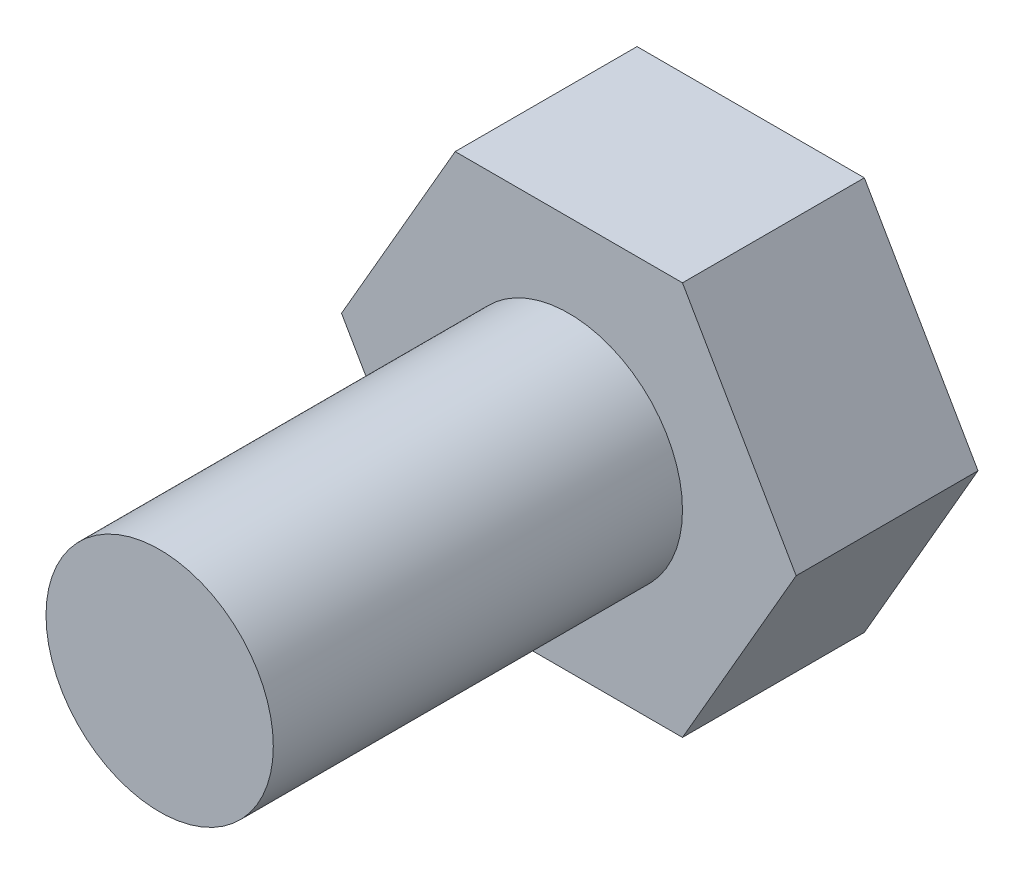
ISO-10303-21;
HEADER;
FILE_DESCRIPTION(('STEP AP214'),'2;1');
FILE_NAME('part.step','',(''),(''),'','','');
FILE_SCHEMA(('AUTOMOTIVE_DESIGN { 1 0 10303 214 1 1 1 1 }'));
ENDSEC;
DATA;
#1=APPLICATION_CONTEXT('core data for automotive mechanical design processes');
#2=APPLICATION_PROTOCOL_DEFINITION('international standard','automotive_design',2000,#1);
#3=PRODUCT_CONTEXT('',#1,'mechanical');
#4=PRODUCT('Part','Part','',(#3));
#5=PRODUCT_RELATED_PRODUCT_CATEGORY('part','',(#4));
#6=PRODUCT_DEFINITION_FORMATION('','',#4);
#7=PRODUCT_DEFINITION_CONTEXT('part definition',#1,'design');
#8=PRODUCT_DEFINITION('design','',#6,#7);
#9=PRODUCT_DEFINITION_SHAPE('','',#8);
#10=(LENGTH_UNIT() NAMED_UNIT(*) SI_UNIT(.MILLI.,.METRE.));
#11=(NAMED_UNIT(*) PLANE_ANGLE_UNIT() SI_UNIT($,.RADIAN.));
#12=(NAMED_UNIT(*) SI_UNIT($,.STERADIAN.) SOLID_ANGLE_UNIT());
#13=UNCERTAINTY_MEASURE_WITH_UNIT(LENGTH_MEASURE(1.E-05),#10,'distance_accuracy_value','');
#14=(GEOMETRIC_REPRESENTATION_CONTEXT(3) GLOBAL_UNCERTAINTY_ASSIGNED_CONTEXT((#13)) GLOBAL_UNIT_ASSIGNED_CONTEXT((#10,
#11,#12)) REPRESENTATION_CONTEXT('',''));
#15=CARTESIAN_POINT('',(0.,0.,0.));
#16=DIRECTION('',(0.,0.,1.));
#17=DIRECTION('',(1.,0.,0.));
#18=AXIS2_PLACEMENT_3D('',#15,#16,#17);
#19=CARTESIAN_POINT('',(2.50000000000005,-4.33012701892216,2.));
#20=DIRECTION('',(-0.866025403784442,0.499999999999995,0.));
#21=DIRECTION('',(-0.499999999999995,-0.866025403784442,0.));
#22=AXIS2_PLACEMENT_3D('',#19,#20,#21);
#23=PLANE('',#22);
#24=DIRECTION('',(0.499999999999995,0.866025403784442,0.));
#25=VECTOR('',#24,1.);
#26=CARTESIAN_POINT('',(2.50000000000005,-4.33012701892216,-2.));
#27=LINE('',#26,#25);
#28=CARTESIAN_POINT('',(2.50000000000005,-4.33012701892216,-2.));
#29=VERTEX_POINT('',#28);
#30=CARTESIAN_POINT('',(5.,0.,-2.));
#31=VERTEX_POINT('',#30);
#32=EDGE_CURVE('E119',#29,#31,#27,.T.);
#33=ORIENTED_EDGE('',*,*,#32,.T.);
#34=DIRECTION('',(0.,0.,-1.));
#35=VECTOR('',#34,1.);
#36=CARTESIAN_POINT('',(5.,0.,2.));
#37=LINE('',#36,#35);
#38=CARTESIAN_POINT('',(5.,0.,2.));
#39=VERTEX_POINT('',#38);
#40=EDGE_CURVE('E36',#39,#31,#37,.T.);
#41=ORIENTED_EDGE('',*,*,#40,.F.);
#42=DIRECTION('',(0.499999999999995,0.866025403784442,0.));
#43=VECTOR('',#42,1.);
#44=CARTESIAN_POINT('',(2.50000000000005,-4.33012701892216,2.));
#45=LINE('',#44,#43);
#46=CARTESIAN_POINT('',(2.50000000000005,-4.33012701892216,2.));
#47=VERTEX_POINT('',#46);
#48=EDGE_CURVE('E130',#47,#39,#45,.T.);
#49=ORIENTED_EDGE('',*,*,#48,.F.);
#50=DIRECTION('',(0.,0.,-1.));
#51=VECTOR('',#50,1.);
#52=CARTESIAN_POINT('',(2.50000000000005,-4.33012701892216,2.));
#53=LINE('',#52,#51);
#54=EDGE_CURVE('E115',#47,#29,#53,.T.);
#55=ORIENTED_EDGE('',*,*,#54,.T.);
#56=EDGE_LOOP('',(#33,#41,#49,#55));
#57=FACE_BOUND('',#56,.T.);
#58=ADVANCED_FACE('F33',(#57),#23,.F.);
#59=CARTESIAN_POINT('',(5.,0.,2.));
#60=DIRECTION('',(-0.866025403784438,-0.500000000000001,0.));
#61=DIRECTION('',(0.500000000000001,-0.866025403784438,0.));
#62=AXIS2_PLACEMENT_3D('',#59,#60,#61);
#63=PLANE('',#62);
#64=DIRECTION('',(-0.500000000000001,0.866025403784438,0.));
#65=VECTOR('',#64,1.);
#66=CARTESIAN_POINT('',(5.,0.,-2.));
#67=LINE('',#66,#65);
#68=CARTESIAN_POINT('',(2.49999999999999,4.3301270189222,-2.));
#69=VERTEX_POINT('',#68);
#70=EDGE_CURVE('E122',#31,#69,#67,.T.);
#71=ORIENTED_EDGE('',*,*,#70,.T.);
#72=DIRECTION('',(0.,0.,-1.));
#73=VECTOR('',#72,1.);
#74=CARTESIAN_POINT('',(2.49999999999999,4.3301270189222,2.));
#75=LINE('',#74,#73);
#76=CARTESIAN_POINT('',(2.49999999999999,4.3301270189222,2.));
#77=VERTEX_POINT('',#76);
#78=EDGE_CURVE('E133',#77,#69,#75,.T.);
#79=ORIENTED_EDGE('',*,*,#78,.F.);
#80=DIRECTION('',(-0.500000000000001,0.866025403784438,0.));
#81=VECTOR('',#80,1.);
#82=CARTESIAN_POINT('',(5.,0.,2.));
#83=LINE('',#82,#81);
#84=EDGE_CURVE('E88',#39,#77,#83,.T.);
#85=ORIENTED_EDGE('',*,*,#84,.F.);
#86=ORIENTED_EDGE('',*,*,#40,.T.);
#87=EDGE_LOOP('',(#71,#79,#85,#86));
#88=FACE_BOUND('',#87,.T.);
#89=ADVANCED_FACE('F138',(#88),#63,.F.);
#90=CARTESIAN_POINT('',(2.49999999999999,4.3301270189222,2.));
#91=DIRECTION('',(0.,-1.,0.));
#92=DIRECTION('',(1.,0.,0.));
#93=AXIS2_PLACEMENT_3D('',#90,#91,#92);
#94=PLANE('',#93);
#95=DIRECTION('',(-1.,0.,0.));
#96=VECTOR('',#95,1.);
#97=CARTESIAN_POINT('',(2.49999999999999,4.3301270189222,-2.));
#98=LINE('',#97,#96);
#99=CARTESIAN_POINT('',(-2.50000000000002,4.33012701892218,-2.));
#100=VERTEX_POINT('',#99);
#101=EDGE_CURVE('E125',#69,#100,#98,.T.);
#102=ORIENTED_EDGE('',*,*,#101,.T.);
#103=DIRECTION('',(0.,0.,-1.));
#104=VECTOR('',#103,1.);
#105=CARTESIAN_POINT('',(-2.50000000000002,4.33012701892218,2.));
#106=LINE('',#105,#104);
#107=CARTESIAN_POINT('',(-2.50000000000002,4.33012701892218,2.));
#108=VERTEX_POINT('',#107);
#109=EDGE_CURVE('E110',#108,#100,#106,.T.);
#110=ORIENTED_EDGE('',*,*,#109,.F.);
#111=DIRECTION('',(-1.,0.,0.));
#112=VECTOR('',#111,1.);
#113=CARTESIAN_POINT('',(2.49999999999999,4.3301270189222,2.));
#114=LINE('',#113,#112);
#115=EDGE_CURVE('E101',#77,#108,#114,.T.);
#116=ORIENTED_EDGE('',*,*,#115,.F.);
#117=ORIENTED_EDGE('',*,*,#78,.T.);
#118=EDGE_LOOP('',(#102,#110,#116,#117));
#119=FACE_BOUND('',#118,.T.);
#120=ADVANCED_FACE('F144',(#119),#94,.F.);
#121=CARTESIAN_POINT('',(-2.50000000000002,4.33012701892218,2.));
#122=DIRECTION('',(0.866025403784441,-0.499999999999995,0.));
#123=DIRECTION('',(0.499999999999995,0.866025403784442,0.));
#124=AXIS2_PLACEMENT_3D('',#121,#122,#123);
#125=PLANE('',#124);
#126=DIRECTION('',(-0.499999999999995,-0.866025403784441,0.));
#127=VECTOR('',#126,1.);
#128=CARTESIAN_POINT('',(-2.50000000000002,4.33012701892218,-2.));
#129=LINE('',#128,#127);
#130=CARTESIAN_POINT('',(-5.,0.,-2.));
#131=VERTEX_POINT('',#130);
#132=EDGE_CURVE('E109',#100,#131,#129,.T.);
#133=ORIENTED_EDGE('',*,*,#132,.T.);
#134=DIRECTION('',(0.,0.,-1.));
#135=VECTOR('',#134,1.);
#136=CARTESIAN_POINT('',(-5.,0.,2.));
#137=LINE('',#136,#135);
#138=CARTESIAN_POINT('',(-5.,0.,2.));
#139=VERTEX_POINT('',#138);
#140=EDGE_CURVE('E106',#139,#131,#137,.T.);
#141=ORIENTED_EDGE('',*,*,#140,.F.);
#142=DIRECTION('',(-0.499999999999995,-0.866025403784441,0.));
#143=VECTOR('',#142,1.);
#144=CARTESIAN_POINT('',(-2.50000000000002,4.33012701892218,2.));
#145=LINE('',#144,#143);
#146=EDGE_CURVE('E95',#108,#139,#145,.T.);
#147=ORIENTED_EDGE('',*,*,#146,.F.);
#148=ORIENTED_EDGE('',*,*,#109,.T.);
#149=EDGE_LOOP('',(#133,#141,#147,#148));
#150=FACE_BOUND('',#149,.T.);
#151=ADVANCED_FACE('F107',(#150),#125,.F.);
#152=CARTESIAN_POINT('',(-5.,0.,2.));
#153=DIRECTION('',(0.866025403784435,0.500000000000007,0.));
#154=DIRECTION('',(-0.500000000000007,0.866025403784435,0.));
#155=AXIS2_PLACEMENT_3D('',#152,#153,#154);
#156=PLANE('',#155);
#157=DIRECTION('',(0.500000000000007,-0.866025403784435,0.));
#158=VECTOR('',#157,1.);
#159=CARTESIAN_POINT('',(-5.,0.,-2.));
#160=LINE('',#159,#158);
#161=CARTESIAN_POINT('',(-2.49999999999996,-4.33012701892222,-2.));
#162=VERTEX_POINT('',#161);
#163=EDGE_CURVE('E73',#131,#162,#160,.T.);
#164=ORIENTED_EDGE('',*,*,#163,.T.);
#165=DIRECTION('',(0.,0.,-1.));
#166=VECTOR('',#165,1.);
#167=CARTESIAN_POINT('',(-2.49999999999996,-4.33012701892222,2.));
#168=LINE('',#167,#166);
#169=CARTESIAN_POINT('',(-2.49999999999996,-4.33012701892222,2.));
#170=VERTEX_POINT('',#169);
#171=EDGE_CURVE('E111',#170,#162,#168,.T.);
#172=ORIENTED_EDGE('',*,*,#171,.F.);
#173=DIRECTION('',(0.500000000000007,-0.866025403784435,0.));
#174=VECTOR('',#173,1.);
#175=CARTESIAN_POINT('',(-5.,0.,2.));
#176=LINE('',#175,#174);
#177=EDGE_CURVE('E99',#139,#170,#176,.T.);
#178=ORIENTED_EDGE('',*,*,#177,.F.);
#179=ORIENTED_EDGE('',*,*,#140,.T.);
#180=EDGE_LOOP('',(#164,#172,#178,#179));
#181=FACE_BOUND('',#180,.T.);
#182=ADVANCED_FACE('F113',(#181),#156,.F.);
#183=CARTESIAN_POINT('',(-2.49999999999996,-4.33012701892222,2.));
#184=DIRECTION('',(0.,1.,0.));
#185=DIRECTION('',(-1.,0.,0.));
#186=AXIS2_PLACEMENT_3D('',#183,#184,#185);
#187=PLANE('',#186);
#188=DIRECTION('',(1.,0.,0.));
#189=VECTOR('',#188,1.);
#190=CARTESIAN_POINT('',(-2.49999999999996,-4.33012701892222,-2.));
#191=LINE('',#190,#189);
#192=EDGE_CURVE('E79',#162,#29,#191,.T.);
#193=ORIENTED_EDGE('',*,*,#192,.T.);
#194=ORIENTED_EDGE('',*,*,#54,.F.);
#195=DIRECTION('',(1.,0.,0.));
#196=VECTOR('',#195,1.);
#197=CARTESIAN_POINT('',(-2.49999999999996,-4.33012701892222,2.));
#198=LINE('',#197,#196);
#199=EDGE_CURVE('E50',#170,#47,#198,.T.);
#200=ORIENTED_EDGE('',*,*,#199,.F.);
#201=ORIENTED_EDGE('',*,*,#171,.T.);
#202=EDGE_LOOP('',(#193,#194,#200,#201));
#203=FACE_BOUND('',#202,.T.);
#204=ADVANCED_FACE('F160',(#203),#187,.F.);
#205=CARTESIAN_POINT('',(0.,0.,2.));
#206=DIRECTION('',(0.,0.,1.));
#207=DIRECTION('',(1.,0.,0.));
#208=AXIS2_PLACEMENT_3D('',#205,#206,#207);
#209=PLANE('',#208);
#210=CARTESIAN_POINT('',(0.,0.,2.));
#211=DIRECTION('',(0.,0.,1.));
#212=DIRECTION('',(1.,0.,0.));
#213=AXIS2_PLACEMENT_3D('',#210,#211,#212);
#214=CIRCLE('',#213,2.5);
#215=CARTESIAN_POINT('',(2.5,0.,2.));
#216=VERTEX_POINT('',#215);
#217=EDGE_CURVE('E11',#216,#216,#214,.T.);
#218=ORIENTED_EDGE('',*,*,#217,.F.);
#219=EDGE_LOOP('',(#218));
#220=FACE_BOUND('',#219,.T.);
#221=ORIENTED_EDGE('',*,*,#48,.T.);
#222=ORIENTED_EDGE('',*,*,#84,.T.);
#223=ORIENTED_EDGE('',*,*,#115,.T.);
#224=ORIENTED_EDGE('',*,*,#146,.T.);
#225=ORIENTED_EDGE('',*,*,#177,.T.);
#226=ORIENTED_EDGE('',*,*,#199,.T.);
#227=EDGE_LOOP('',(#221,#222,#223,#224,#225,#226));
#228=FACE_BOUND('',#227,.T.);
#229=ADVANCED_FACE('F97',(#220,#228),#209,.T.);
#230=CARTESIAN_POINT('',(0.,0.,-2.));
#231=DIRECTION('',(0.,0.,1.));
#232=DIRECTION('',(1.,0.,0.));
#233=AXIS2_PLACEMENT_3D('',#230,#231,#232);
#234=PLANE('',#233);
#235=ORIENTED_EDGE('',*,*,#32,.F.);
#236=ORIENTED_EDGE('',*,*,#192,.F.);
#237=ORIENTED_EDGE('',*,*,#163,.F.);
#238=ORIENTED_EDGE('',*,*,#132,.F.);
#239=ORIENTED_EDGE('',*,*,#101,.F.);
#240=ORIENTED_EDGE('',*,*,#70,.F.);
#241=EDGE_LOOP('',(#235,#236,#237,#238,#239,#240));
#242=FACE_BOUND('',#241,.T.);
#243=ADVANCED_FACE('F143',(#242),#234,.F.);
#244=CARTESIAN_POINT('',(0.,0.,11.));
#245=DIRECTION('',(0.,0.,-1.));
#246=DIRECTION('',(-1.,0.,0.));
#247=AXIS2_PLACEMENT_3D('',#244,#245,#246);
#248=CYLINDRICAL_SURFACE('',#247,2.5);
#249=CARTESIAN_POINT('',(0.,0.,11.));
#250=DIRECTION('',(0.,0.,1.));
#251=DIRECTION('',(1.,0.,0.));
#252=AXIS2_PLACEMENT_3D('',#249,#250,#251);
#253=CIRCLE('',#252,2.5);
#254=CARTESIAN_POINT('',(2.5,0.,11.));
#255=VERTEX_POINT('',#254);
#256=EDGE_CURVE('E123',#255,#255,#253,.T.);
#257=ORIENTED_EDGE('',*,*,#256,.F.);
#258=EDGE_LOOP('',(#257));
#259=FACE_BOUND('',#258,.T.);
#260=ORIENTED_EDGE('',*,*,#217,.T.);
#261=EDGE_LOOP('',(#260));
#262=FACE_BOUND('',#261,.T.);
#263=ADVANCED_FACE('F153',(#259,#262),#248,.T.);
#264=CARTESIAN_POINT('',(0.,0.,11.));
#265=DIRECTION('',(0.,0.,1.));
#266=DIRECTION('',(1.,0.,0.));
#267=AXIS2_PLACEMENT_3D('',#264,#265,#266);
#268=PLANE('',#267);
#269=ORIENTED_EDGE('',*,*,#256,.T.);
#270=EDGE_LOOP('',(#269));
#271=FACE_BOUND('',#270,.T.);
#272=ADVANCED_FACE('F151',(#271),#268,.T.);
#273=CLOSED_SHELL('',(#58,#89,#120,#151,#182,#204,#229,#243,#263,#272));
#274=MANIFOLD_SOLID_BREP('B2',#273);
#275=ADVANCED_BREP_SHAPE_REPRESENTATION('',(#18,#274),#14);
#276=SHAPE_DEFINITION_REPRESENTATION(#9,#275);
ENDSEC;
END-ISO-10303-21;
